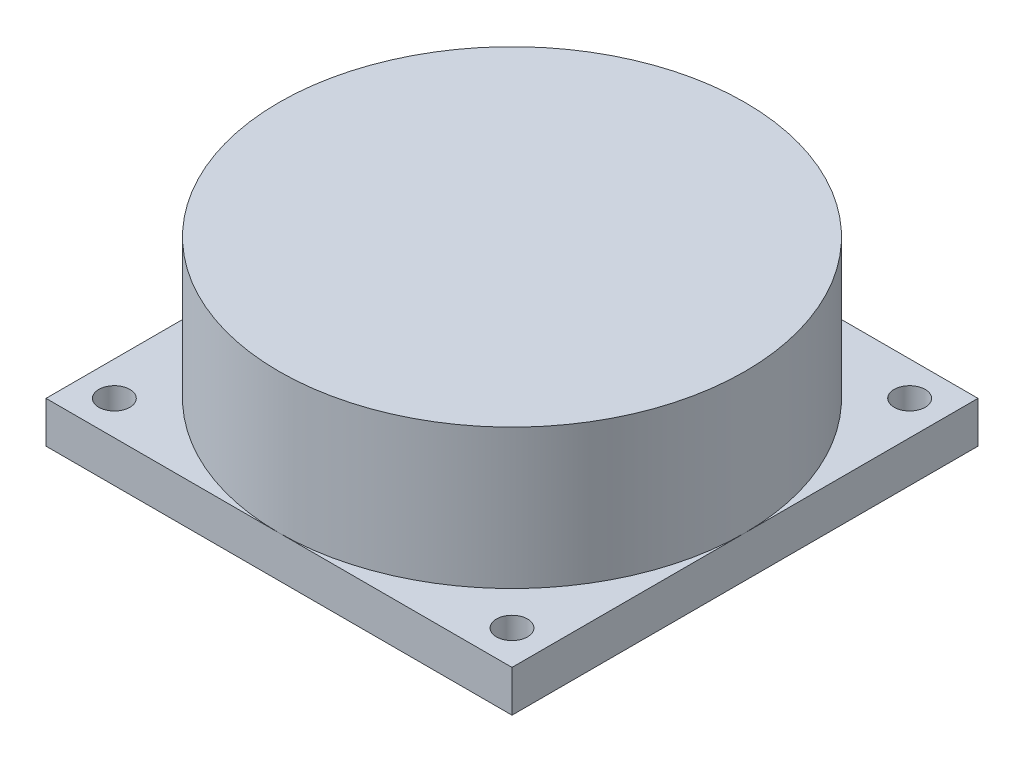
ISO-10303-21;
HEADER;
FILE_DESCRIPTION(('STEP AP214'),'2;1');
FILE_NAME('part.step','',(''),(''),'','','');
FILE_SCHEMA(('AUTOMOTIVE_DESIGN { 1 0 10303 214 1 1 1 1 }'));
ENDSEC;
DATA;
#1=APPLICATION_CONTEXT('core data for automotive mechanical design processes');
#2=APPLICATION_PROTOCOL_DEFINITION('international standard','automotive_design',2000,#1);
#3=PRODUCT_CONTEXT('',#1,'mechanical');
#4=PRODUCT('Part','Part','',(#3));
#5=PRODUCT_RELATED_PRODUCT_CATEGORY('part','',(#4));
#6=PRODUCT_DEFINITION_FORMATION('','',#4);
#7=PRODUCT_DEFINITION_CONTEXT('part definition',#1,'design');
#8=PRODUCT_DEFINITION('design','',#6,#7);
#9=PRODUCT_DEFINITION_SHAPE('','',#8);
#10=(LENGTH_UNIT() NAMED_UNIT(*) SI_UNIT(.MILLI.,.METRE.));
#11=(NAMED_UNIT(*) PLANE_ANGLE_UNIT() SI_UNIT($,.RADIAN.));
#12=(NAMED_UNIT(*) SI_UNIT($,.STERADIAN.) SOLID_ANGLE_UNIT());
#13=UNCERTAINTY_MEASURE_WITH_UNIT(LENGTH_MEASURE(1.E-05),#10,'distance_accuracy_value','');
#14=(GEOMETRIC_REPRESENTATION_CONTEXT(3) GLOBAL_UNCERTAINTY_ASSIGNED_CONTEXT((#13)) GLOBAL_UNIT_ASSIGNED_CONTEXT((#10,
#11,#12)) REPRESENTATION_CONTEXT('',''));
#15=CARTESIAN_POINT('',(0.,0.,0.));
#16=DIRECTION('',(0.,0.,1.));
#17=DIRECTION('',(1.,0.,0.));
#18=AXIS2_PLACEMENT_3D('',#15,#16,#17);
#19=CARTESIAN_POINT('',(0.,4.,0.));
#20=DIRECTION('',(0.,1.,0.));
#21=DIRECTION('',(0.,0.,1.));
#22=AXIS2_PLACEMENT_3D('',#19,#20,#21);
#23=PLANE('',#22);
#24=CARTESIAN_POINT('',(-19.2,4.,19.2));
#25=DIRECTION('',(0.,1.,0.));
#26=DIRECTION('',(0.,0.,1.));
#27=AXIS2_PLACEMENT_3D('',#24,#25,#26);
#28=CIRCLE('',#27,1.5);
#29=CARTESIAN_POINT('',(-19.2,4.,20.7));
#30=VERTEX_POINT('',#29);
#31=EDGE_CURVE('E192',#30,#30,#28,.T.);
#32=ORIENTED_EDGE('',*,*,#31,.F.);
#33=EDGE_LOOP('',(#32));
#34=FACE_BOUND('',#33,.T.);
#35=DIRECTION('',(1.,0.,0.));
#36=VECTOR('',#35,1.);
#37=CARTESIAN_POINT('',(0.,4.,22.5));
#38=LINE('',#37,#36);
#39=CARTESIAN_POINT('',(-22.5,4.,22.5));
#40=VERTEX_POINT('',#39);
#41=CARTESIAN_POINT('',(0.,4.,22.5));
#42=VERTEX_POINT('',#41);
#43=EDGE_CURVE('E133',#40,#42,#38,.T.);
#44=ORIENTED_EDGE('',*,*,#43,.T.);
#45=CARTESIAN_POINT('',(0.,4.,0.));
#46=DIRECTION('',(0.,1.,0.));
#47=DIRECTION('',(0.,0.,1.));
#48=AXIS2_PLACEMENT_3D('',#45,#46,#47);
#49=CIRCLE('',#48,22.5);
#50=CARTESIAN_POINT('',(-22.5,4.,0.));
#51=VERTEX_POINT('',#50);
#52=EDGE_CURVE('E63',#42,#51,#49,.F.);
#53=ORIENTED_EDGE('',*,*,#52,.T.);
#54=DIRECTION('',(0.,0.,1.));
#55=VECTOR('',#54,1.);
#56=CARTESIAN_POINT('',(-22.5,4.,0.));
#57=LINE('',#56,#55);
#58=EDGE_CURVE('E71',#51,#40,#57,.T.);
#59=ORIENTED_EDGE('',*,*,#58,.T.);
#60=EDGE_LOOP('',(#44,#53,#59));
#61=FACE_BOUND('',#60,.T.);
#62=ADVANCED_FACE('F47',(#34,#61),#23,.T.);
#63=CARTESIAN_POINT('',(-19.2,4.,-19.2));
#64=DIRECTION('',(0.,1.,0.));
#65=DIRECTION('',(0.,0.,1.));
#66=AXIS2_PLACEMENT_3D('',#63,#64,#65);
#67=CIRCLE('',#66,1.5);
#68=CARTESIAN_POINT('',(-19.2,4.,-17.7));
#69=VERTEX_POINT('',#68);
#70=EDGE_CURVE('E151',#69,#69,#67,.T.);
#71=ORIENTED_EDGE('',*,*,#70,.F.);
#72=EDGE_LOOP('',(#71));
#73=FACE_BOUND('',#72,.T.);
#74=CARTESIAN_POINT('',(-22.5,4.,-22.5));
#75=VERTEX_POINT('',#74);
#76=EDGE_CURVE('E147',#75,#51,#57,.T.);
#77=ORIENTED_EDGE('',*,*,#76,.T.);
#78=CARTESIAN_POINT('',(0.,4.,-22.5));
#79=VERTEX_POINT('',#78);
#80=EDGE_CURVE('E127',#51,#79,#49,.F.);
#81=ORIENTED_EDGE('',*,*,#80,.T.);
#82=DIRECTION('',(1.,0.,0.));
#83=VECTOR('',#82,1.);
#84=CARTESIAN_POINT('',(0.,4.,-22.5));
#85=LINE('',#84,#83);
#86=EDGE_CURVE('E141',#75,#79,#85,.T.);
#87=ORIENTED_EDGE('',*,*,#86,.F.);
#88=EDGE_LOOP('',(#77,#81,#87));
#89=FACE_BOUND('',#88,.T.);
#90=ADVANCED_FACE('F213',(#73,#89),#23,.T.);
#91=CARTESIAN_POINT('',(19.2,4.,-19.2));
#92=DIRECTION('',(0.,1.,0.));
#93=DIRECTION('',(0.,0.,1.));
#94=AXIS2_PLACEMENT_3D('',#91,#92,#93);
#95=CIRCLE('',#94,1.5);
#96=CARTESIAN_POINT('',(19.2,4.,-17.7));
#97=VERTEX_POINT('',#96);
#98=EDGE_CURVE('E155',#97,#97,#95,.T.);
#99=ORIENTED_EDGE('',*,*,#98,.F.);
#100=EDGE_LOOP('',(#99));
#101=FACE_BOUND('',#100,.T.);
#102=CARTESIAN_POINT('',(22.5,4.,-22.5));
#103=VERTEX_POINT('',#102);
#104=EDGE_CURVE('E124',#79,#103,#85,.T.);
#105=ORIENTED_EDGE('',*,*,#104,.F.);
#106=CARTESIAN_POINT('',(22.5,4.,0.));
#107=VERTEX_POINT('',#106);
#108=EDGE_CURVE('E112',#79,#107,#49,.F.);
#109=ORIENTED_EDGE('',*,*,#108,.T.);
#110=DIRECTION('',(0.,0.,1.));
#111=VECTOR('',#110,1.);
#112=CARTESIAN_POINT('',(22.5,4.,0.));
#113=LINE('',#112,#111);
#114=EDGE_CURVE('E123',#103,#107,#113,.T.);
#115=ORIENTED_EDGE('',*,*,#114,.F.);
#116=EDGE_LOOP('',(#105,#109,#115));
#117=FACE_BOUND('',#116,.T.);
#118=ADVANCED_FACE('F122',(#101,#117),#23,.T.);
#119=CARTESIAN_POINT('',(0.,4.,22.5));
#120=DIRECTION('',(0.,0.,-1.));
#121=DIRECTION('',(-1.,0.,0.));
#122=AXIS2_PLACEMENT_3D('',#119,#120,#121);
#123=PLANE('',#122);
#124=DIRECTION('',(1.,0.,0.));
#125=VECTOR('',#124,1.);
#126=CARTESIAN_POINT('',(0.,0.,22.5));
#127=LINE('',#126,#125);
#128=CARTESIAN_POINT('',(-22.5,0.,22.5));
#129=VERTEX_POINT('',#128);
#130=CARTESIAN_POINT('',(22.5,0.,22.5));
#131=VERTEX_POINT('',#130);
#132=EDGE_CURVE('E168',#129,#131,#127,.T.);
#133=ORIENTED_EDGE('',*,*,#132,.T.);
#134=DIRECTION('',(0.,-1.,0.));
#135=VECTOR('',#134,1.);
#136=CARTESIAN_POINT('',(22.5,4.,22.5));
#137=LINE('',#136,#135);
#138=CARTESIAN_POINT('',(22.5,4.,22.5));
#139=VERTEX_POINT('',#138);
#140=EDGE_CURVE('E11',#139,#131,#137,.T.);
#141=ORIENTED_EDGE('',*,*,#140,.F.);
#142=EDGE_CURVE('E130',#42,#139,#38,.T.);
#143=ORIENTED_EDGE('',*,*,#142,.F.);
#144=ORIENTED_EDGE('',*,*,#43,.F.);
#145=DIRECTION('',(0.,-1.,0.));
#146=VECTOR('',#145,1.);
#147=CARTESIAN_POINT('',(-22.5,4.,22.5));
#148=LINE('',#147,#146);
#149=EDGE_CURVE('E163',#40,#129,#148,.T.);
#150=ORIENTED_EDGE('',*,*,#149,.T.);
#151=EDGE_LOOP('',(#133,#141,#143,#144,#150));
#152=FACE_BOUND('',#151,.T.);
#153=ADVANCED_FACE('F206',(#152),#123,.F.);
#154=CARTESIAN_POINT('',(22.5,4.,0.));
#155=DIRECTION('',(1.,0.,0.));
#156=DIRECTION('',(0.,0.,-1.));
#157=AXIS2_PLACEMENT_3D('',#154,#155,#156);
#158=PLANE('',#157);
#159=ORIENTED_EDGE('',*,*,#114,.T.);
#160=EDGE_CURVE('E99',#107,#139,#113,.T.);
#161=ORIENTED_EDGE('',*,*,#160,.T.);
#162=ORIENTED_EDGE('',*,*,#140,.T.);
#163=DIRECTION('',(0.,0.,1.));
#164=VECTOR('',#163,1.);
#165=CARTESIAN_POINT('',(22.5,0.,0.));
#166=LINE('',#165,#164);
#167=CARTESIAN_POINT('',(22.5,0.,-22.5));
#168=VERTEX_POINT('',#167);
#169=EDGE_CURVE('E172',#168,#131,#166,.T.);
#170=ORIENTED_EDGE('',*,*,#169,.F.);
#171=DIRECTION('',(0.,-1.,0.));
#172=VECTOR('',#171,1.);
#173=CARTESIAN_POINT('',(22.5,4.,-22.5));
#174=LINE('',#173,#172);
#175=EDGE_CURVE('E56',#103,#168,#174,.T.);
#176=ORIENTED_EDGE('',*,*,#175,.F.);
#177=EDGE_LOOP('',(#159,#161,#162,#170,#176));
#178=FACE_BOUND('',#177,.T.);
#179=ADVANCED_FACE('F136',(#178),#158,.T.);
#180=CARTESIAN_POINT('',(0.,4.,-22.5));
#181=DIRECTION('',(0.,0.,-1.));
#182=DIRECTION('',(-1.,0.,0.));
#183=AXIS2_PLACEMENT_3D('',#180,#181,#182);
#184=PLANE('',#183);
#185=ORIENTED_EDGE('',*,*,#86,.T.);
#186=ORIENTED_EDGE('',*,*,#104,.T.);
#187=ORIENTED_EDGE('',*,*,#175,.T.);
#188=DIRECTION('',(1.,0.,0.));
#189=VECTOR('',#188,1.);
#190=CARTESIAN_POINT('',(0.,0.,-22.5));
#191=LINE('',#190,#189);
#192=CARTESIAN_POINT('',(-22.5,0.,-22.5));
#193=VERTEX_POINT('',#192);
#194=EDGE_CURVE('E175',#193,#168,#191,.T.);
#195=ORIENTED_EDGE('',*,*,#194,.F.);
#196=DIRECTION('',(0.,-1.,0.));
#197=VECTOR('',#196,1.);
#198=CARTESIAN_POINT('',(-22.5,4.,-22.5));
#199=LINE('',#198,#197);
#200=EDGE_CURVE('E195',#75,#193,#199,.T.);
#201=ORIENTED_EDGE('',*,*,#200,.F.);
#202=EDGE_LOOP('',(#185,#186,#187,#195,#201));
#203=FACE_BOUND('',#202,.T.);
#204=ADVANCED_FACE('F200',(#203),#184,.T.);
#205=CARTESIAN_POINT('',(19.2,4.,-19.2));
#206=DIRECTION('',(0.,-1.,0.));
#207=DIRECTION('',(0.,0.,-1.));
#208=AXIS2_PLACEMENT_3D('',#205,#206,#207);
#209=CYLINDRICAL_SURFACE('',#208,1.5);
#210=ORIENTED_EDGE('',*,*,#98,.T.);
#211=EDGE_LOOP('',(#210));
#212=FACE_BOUND('',#211,.T.);
#213=CARTESIAN_POINT('',(19.2,0.,-19.2));
#214=DIRECTION('',(0.,1.,0.));
#215=DIRECTION('',(0.,0.,1.));
#216=AXIS2_PLACEMENT_3D('',#213,#214,#215);
#217=CIRCLE('',#216,1.5);
#218=CARTESIAN_POINT('',(19.2,0.,-17.7));
#219=VERTEX_POINT('',#218);
#220=EDGE_CURVE('E184',#219,#219,#217,.T.);
#221=ORIENTED_EDGE('',*,*,#220,.F.);
#222=EDGE_LOOP('',(#221));
#223=FACE_BOUND('',#222,.T.);
#224=ADVANCED_FACE('F248',(#212,#223),#209,.F.);
#225=CARTESIAN_POINT('',(-19.2,4.,-19.2));
#226=DIRECTION('',(0.,-1.,0.));
#227=DIRECTION('',(0.,0.,-1.));
#228=AXIS2_PLACEMENT_3D('',#225,#226,#227);
#229=CYLINDRICAL_SURFACE('',#228,1.5);
#230=ORIENTED_EDGE('',*,*,#70,.T.);
#231=EDGE_LOOP('',(#230));
#232=FACE_BOUND('',#231,.T.);
#233=CARTESIAN_POINT('',(-19.2,0.,-19.2));
#234=DIRECTION('',(0.,1.,0.));
#235=DIRECTION('',(0.,0.,1.));
#236=AXIS2_PLACEMENT_3D('',#233,#234,#235);
#237=CIRCLE('',#236,1.5);
#238=CARTESIAN_POINT('',(-19.2,0.,-17.7));
#239=VERTEX_POINT('',#238);
#240=EDGE_CURVE('E180',#239,#239,#237,.T.);
#241=ORIENTED_EDGE('',*,*,#240,.F.);
#242=EDGE_LOOP('',(#241));
#243=FACE_BOUND('',#242,.T.);
#244=ADVANCED_FACE('F251',(#232,#243),#229,.F.);
#245=CARTESIAN_POINT('',(-22.5,4.,0.));
#246=DIRECTION('',(1.,0.,0.));
#247=DIRECTION('',(0.,0.,-1.));
#248=AXIS2_PLACEMENT_3D('',#245,#246,#247);
#249=PLANE('',#248);
#250=DIRECTION('',(0.,0.,1.));
#251=VECTOR('',#250,1.);
#252=CARTESIAN_POINT('',(-22.5,0.,0.));
#253=LINE('',#252,#251);
#254=EDGE_CURVE('E92',#193,#129,#253,.T.);
#255=ORIENTED_EDGE('',*,*,#254,.T.);
#256=ORIENTED_EDGE('',*,*,#149,.F.);
#257=ORIENTED_EDGE('',*,*,#58,.F.);
#258=ORIENTED_EDGE('',*,*,#76,.F.);
#259=ORIENTED_EDGE('',*,*,#200,.T.);
#260=EDGE_LOOP('',(#255,#256,#257,#258,#259));
#261=FACE_BOUND('',#260,.T.);
#262=ADVANCED_FACE('F208',(#261),#249,.F.);
#263=CARTESIAN_POINT('',(-19.2,4.,19.2));
#264=DIRECTION('',(0.,-1.,0.));
#265=DIRECTION('',(0.,0.,-1.));
#266=AXIS2_PLACEMENT_3D('',#263,#264,#265);
#267=CYLINDRICAL_SURFACE('',#266,1.5);
#268=ORIENTED_EDGE('',*,*,#31,.T.);
#269=EDGE_LOOP('',(#268));
#270=FACE_BOUND('',#269,.T.);
#271=CARTESIAN_POINT('',(-19.2,0.,19.2));
#272=DIRECTION('',(0.,1.,0.));
#273=DIRECTION('',(0.,0.,1.));
#274=AXIS2_PLACEMENT_3D('',#271,#272,#273);
#275=CIRCLE('',#274,1.5);
#276=CARTESIAN_POINT('',(-19.2,0.,20.7));
#277=VERTEX_POINT('',#276);
#278=EDGE_CURVE('E164',#277,#277,#275,.T.);
#279=ORIENTED_EDGE('',*,*,#278,.F.);
#280=EDGE_LOOP('',(#279));
#281=FACE_BOUND('',#280,.T.);
#282=ADVANCED_FACE('F49',(#270,#281),#267,.F.);
#283=CARTESIAN_POINT('',(19.2,4.,19.2));
#284=DIRECTION('',(0.,-1.,0.));
#285=DIRECTION('',(0.,0.,-1.));
#286=AXIS2_PLACEMENT_3D('',#283,#284,#285);
#287=CYLINDRICAL_SURFACE('',#286,1.5);
#288=CARTESIAN_POINT('',(19.2,4.,19.2));
#289=DIRECTION('',(0.,1.,0.));
#290=DIRECTION('',(0.,0.,1.));
#291=AXIS2_PLACEMENT_3D('',#288,#289,#290);
#292=CIRCLE('',#291,1.5);
#293=CARTESIAN_POINT('',(19.2,4.,20.7));
#294=VERTEX_POINT('',#293);
#295=EDGE_CURVE('E159',#294,#294,#292,.T.);
#296=ORIENTED_EDGE('',*,*,#295,.T.);
#297=EDGE_LOOP('',(#296));
#298=FACE_BOUND('',#297,.T.);
#299=CARTESIAN_POINT('',(19.2,0.,19.2));
#300=DIRECTION('',(0.,1.,0.));
#301=DIRECTION('',(0.,0.,1.));
#302=AXIS2_PLACEMENT_3D('',#299,#300,#301);
#303=CIRCLE('',#302,1.5);
#304=CARTESIAN_POINT('',(19.2,0.,20.7));
#305=VERTEX_POINT('',#304);
#306=EDGE_CURVE('E188',#305,#305,#303,.T.);
#307=ORIENTED_EDGE('',*,*,#306,.F.);
#308=EDGE_LOOP('',(#307));
#309=FACE_BOUND('',#308,.T.);
#310=ADVANCED_FACE('F234',(#298,#309),#287,.F.);
#311=ORIENTED_EDGE('',*,*,#160,.F.);
#312=EDGE_CURVE('E108',#107,#42,#49,.F.);
#313=ORIENTED_EDGE('',*,*,#312,.T.);
#314=ORIENTED_EDGE('',*,*,#142,.T.);
#315=EDGE_LOOP('',(#311,#313,#314));
#316=FACE_BOUND('',#315,.T.);
#317=ORIENTED_EDGE('',*,*,#295,.F.);
#318=EDGE_LOOP('',(#317));
#319=FACE_BOUND('',#318,.T.);
#320=ADVANCED_FACE('F128',(#316,#319),#23,.T.);
#321=CARTESIAN_POINT('',(0.,0.,0.));
#322=DIRECTION('',(0.,1.,0.));
#323=DIRECTION('',(0.,0.,1.));
#324=AXIS2_PLACEMENT_3D('',#321,#322,#323);
#325=PLANE('',#324);
#326=ORIENTED_EDGE('',*,*,#169,.T.);
#327=ORIENTED_EDGE('',*,*,#132,.F.);
#328=ORIENTED_EDGE('',*,*,#254,.F.);
#329=ORIENTED_EDGE('',*,*,#194,.T.);
#330=EDGE_LOOP('',(#326,#327,#328,#329));
#331=FACE_BOUND('',#330,.T.);
#332=ORIENTED_EDGE('',*,*,#306,.T.);
#333=EDGE_LOOP('',(#332));
#334=FACE_BOUND('',#333,.T.);
#335=ORIENTED_EDGE('',*,*,#220,.T.);
#336=EDGE_LOOP('',(#335));
#337=FACE_BOUND('',#336,.T.);
#338=ORIENTED_EDGE('',*,*,#240,.T.);
#339=EDGE_LOOP('',(#338));
#340=FACE_BOUND('',#339,.T.);
#341=ORIENTED_EDGE('',*,*,#278,.T.);
#342=EDGE_LOOP('',(#341));
#343=FACE_BOUND('',#342,.T.);
#344=ADVANCED_FACE('F203',(#331,#334,#337,#340,#343),#325,.F.);
#345=CARTESIAN_POINT('',(0.,17.5,0.));
#346=DIRECTION('',(0.,-1.,0.));
#347=DIRECTION('',(0.,0.,-1.));
#348=AXIS2_PLACEMENT_3D('',#345,#346,#347);
#349=CYLINDRICAL_SURFACE('',#348,22.5);
#350=ORIENTED_EDGE('',*,*,#52,.F.);
#351=ORIENTED_EDGE('',*,*,#312,.F.);
#352=ORIENTED_EDGE('',*,*,#108,.F.);
#353=ORIENTED_EDGE('',*,*,#80,.F.);
#354=EDGE_LOOP('',(#350,#351,#352,#353));
#355=FACE_BOUND('',#354,.T.);
#356=CARTESIAN_POINT('',(0.,17.5,0.));
#357=DIRECTION('',(0.,1.,0.));
#358=DIRECTION('',(0.,0.,1.));
#359=AXIS2_PLACEMENT_3D('',#356,#357,#358);
#360=CIRCLE('',#359,22.5);
#361=CARTESIAN_POINT('',(0.,17.5,22.5));
#362=VERTEX_POINT('',#361);
#363=EDGE_CURVE('E117',#362,#362,#360,.T.);
#364=ORIENTED_EDGE('',*,*,#363,.F.);
#365=EDGE_LOOP('',(#364));
#366=FACE_BOUND('',#365,.T.);
#367=ADVANCED_FACE('F110',(#355,#366),#349,.T.);
#368=CARTESIAN_POINT('',(0.,17.5,0.));
#369=DIRECTION('',(0.,1.,0.));
#370=DIRECTION('',(0.,0.,1.));
#371=AXIS2_PLACEMENT_3D('',#368,#369,#370);
#372=PLANE('',#371);
#373=ORIENTED_EDGE('',*,*,#363,.T.);
#374=EDGE_LOOP('',(#373));
#375=FACE_BOUND('',#374,.T.);
#376=ADVANCED_FACE('F387',(#375),#372,.T.);
#377=CLOSED_SHELL('',(#62,#90,#118,#153,#179,#204,#224,#244,#262,#282,#310,#320,#344,#367,#376));
#378=MANIFOLD_SOLID_BREP('B2',#377);
#379=ADVANCED_BREP_SHAPE_REPRESENTATION('',(#18,#378),#14);
#380=SHAPE_DEFINITION_REPRESENTATION(#9,#379);
ENDSEC;
END-ISO-10303-21;
